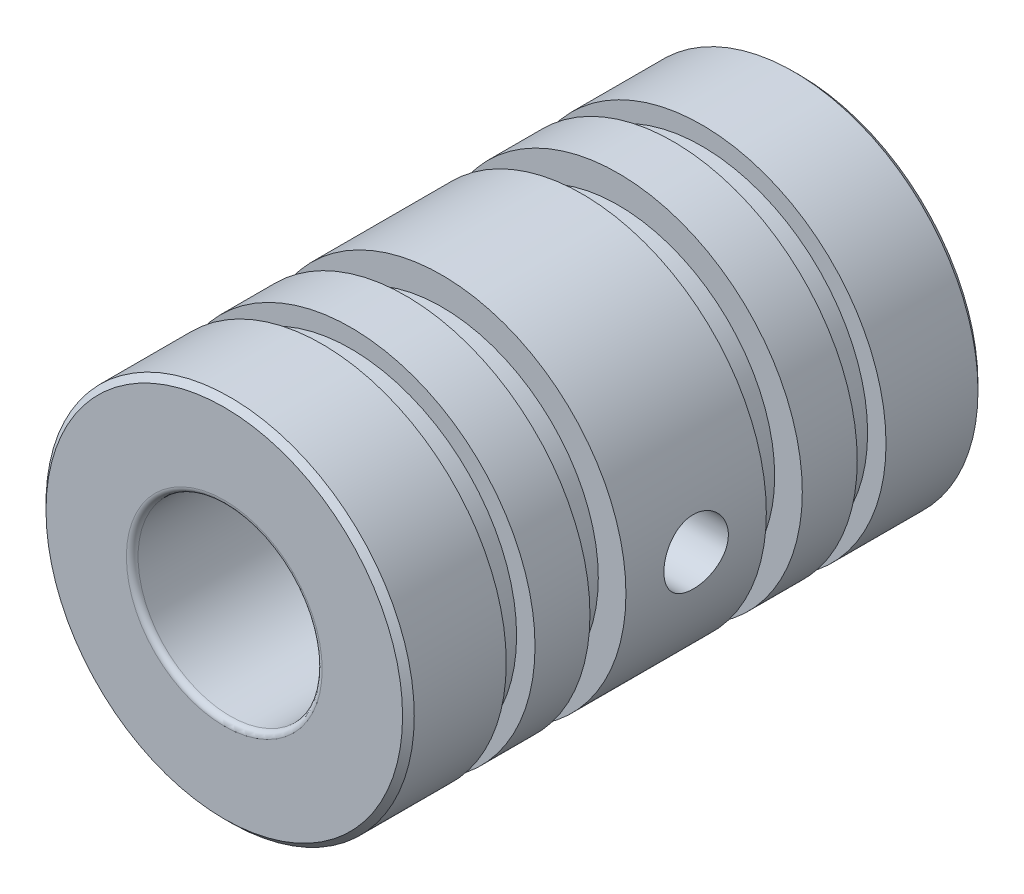
ISO-10303-21;
HEADER;
FILE_DESCRIPTION(('STEP AP214'),'2;1');
FILE_NAME('part.step','',(''),(''),'','','');
FILE_SCHEMA(('AUTOMOTIVE_DESIGN { 1 0 10303 214 1 1 1 1 }'));
ENDSEC;
DATA;
#1=APPLICATION_CONTEXT('core data for automotive mechanical design processes');
#2=APPLICATION_PROTOCOL_DEFINITION('international standard','automotive_design',2000,#1);
#3=PRODUCT_CONTEXT('',#1,'mechanical');
#4=PRODUCT('Part','Part','',(#3));
#5=PRODUCT_RELATED_PRODUCT_CATEGORY('part','',(#4));
#6=PRODUCT_DEFINITION_FORMATION('','',#4);
#7=PRODUCT_DEFINITION_CONTEXT('part definition',#1,'design');
#8=PRODUCT_DEFINITION('design','',#6,#7);
#9=PRODUCT_DEFINITION_SHAPE('','',#8);
#10=(LENGTH_UNIT() NAMED_UNIT(*) SI_UNIT(.MILLI.,.METRE.));
#11=(NAMED_UNIT(*) PLANE_ANGLE_UNIT() SI_UNIT($,.RADIAN.));
#12=(NAMED_UNIT(*) SI_UNIT($,.STERADIAN.) SOLID_ANGLE_UNIT());
#13=UNCERTAINTY_MEASURE_WITH_UNIT(LENGTH_MEASURE(1.E-05),#10,'distance_accuracy_value','');
#14=(GEOMETRIC_REPRESENTATION_CONTEXT(3) GLOBAL_UNCERTAINTY_ASSIGNED_CONTEXT((#13)) GLOBAL_UNIT_ASSIGNED_CONTEXT((#10,
#11,#12)) REPRESENTATION_CONTEXT('',''));
#15=CARTESIAN_POINT('',(0.,0.,0.));
#16=DIRECTION('',(0.,0.,1.));
#17=DIRECTION('',(1.,0.,0.));
#18=AXIS2_PLACEMENT_3D('',#15,#16,#17);
#19=CARTESIAN_POINT('',(0.,0.,12.5));
#20=DIRECTION('',(0.,0.,1.));
#21=DIRECTION('',(1.,0.,0.));
#22=AXIS2_PLACEMENT_3D('',#19,#20,#21);
#23=CYLINDRICAL_SURFACE('',#22,8.00000000000001);
#24=CARTESIAN_POINT('',(0.,0.,-3.05));
#25=DIRECTION('',(0.,0.,1.));
#26=DIRECTION('',(1.,0.,0.));
#27=AXIS2_PLACEMENT_3D('',#24,#25,#26);
#28=CIRCLE('',#27,8.00000000000002);
#29=CARTESIAN_POINT('',(8.00000000000002,0.,-3.05));
#30=VERTEX_POINT('',#29);
#31=EDGE_CURVE('E172',#30,#30,#28,.T.);
#32=ORIENTED_EDGE('',*,*,#31,.T.);
#33=EDGE_LOOP('',(#32));
#34=FACE_BOUND('',#33,.T.);
#35=CARTESIAN_POINT('',(8.00000000000001,0.,1.4));
#36=CARTESIAN_POINT('',(7.99999862840796,0.0780001751982829,1.39999692611606));
#37=CARTESIAN_POINT('',(7.99884740244653,0.156041460388733,1.39345937499059));
#38=CARTESIAN_POINT('',(7.99436582981277,0.309931215090021,1.36749507603401));
#39=CARTESIAN_POINT('',(7.99103354295156,0.385777669375428,1.34805685203911));
#40=CARTESIAN_POINT('',(7.98256322233297,0.533029372885323,1.29689940960397));
#41=CARTESIAN_POINT('',(7.97742672577383,0.604438342110771,1.26519064341269));
#42=CARTESIAN_POINT('',(7.96591125757,0.740914380295736,1.19042049275119));
#43=CARTESIAN_POINT('',(7.95953241187612,0.805982091136898,1.14736025894958));
#44=CARTESIAN_POINT('',(7.94616333498249,0.928619664519326,1.05062911217629));
#45=CARTESIAN_POINT('',(7.93916792163053,0.98611331984882,0.996862288286269));
#46=CARTESIAN_POINT('',(7.92539333056963,1.09131207719895,0.880450610451831));
#47=CARTESIAN_POINT('',(7.9186141672383,1.1390165295148,0.817805167703874));
#48=CARTESIAN_POINT('',(7.90598940099177,1.22359263935587,0.684885149818804));
#49=CARTESIAN_POINT('',(7.90015048940323,1.26038809619578,0.614561397517274));
#50=CARTESIAN_POINT('',(7.89013968959291,1.32161424136419,0.468611686073754));
#51=CARTESIAN_POINT('',(7.88596767685164,1.34604585332424,0.392986123480127));
#52=CARTESIAN_POINT('',(7.87981487136541,1.38160892847224,0.239390374846856));
#53=CARTESIAN_POINT('',(7.87781233032343,1.39287248959928,0.161451662324599));
#54=CARTESIAN_POINT('',(7.87615950549021,1.4021894800746,0.00476682590525788));
#55=CARTESIAN_POINT('',(7.87650903814844,1.40024394023127,-0.0739792345093653));
#56=CARTESIAN_POINT('',(7.87950103221331,1.38330536571091,-0.229095080346222));
#57=CARTESIAN_POINT('',(7.88211729196638,1.36846142113836,-0.305481725712561));
#58=CARTESIAN_POINT('',(7.88930688598159,1.32638169291944,-0.454663385873732));
#59=CARTESIAN_POINT('',(7.89388029360826,1.29914544473986,-0.527458265915615));
#60=CARTESIAN_POINT('',(7.90449682748978,1.23290516888148,-0.667832435606908));
#61=CARTESIAN_POINT('',(7.91054757059616,1.19383989394346,-0.735382223888715));
#62=CARTESIAN_POINT('',(7.92343182192954,1.10509390234727,-0.863024295264756));
#63=CARTESIAN_POINT('',(7.93026539961879,1.05541224334011,-0.923115915595786));
#64=CARTESIAN_POINT('',(7.94406011076402,0.946034723012704,-1.03499826759902));
#65=CARTESIAN_POINT('',(7.95102170984662,0.886211094489708,-1.08666411645392));
#66=CARTESIAN_POINT('',(7.96420180074155,0.758678144941895,-1.17924395538032));
#67=CARTESIAN_POINT('',(7.97042028681019,0.690968762974272,-1.22015786235052));
#68=CARTESIAN_POINT('',(7.98142370312537,0.549463949214037,-1.29008648652475));
#69=CARTESIAN_POINT('',(7.98620721208567,0.475662575179345,-1.31908941681279));
#70=CARTESIAN_POINT('',(7.99379047518486,0.324133596898233,-1.36425291754901));
#71=CARTESIAN_POINT('',(7.99659041251567,0.246406355934077,-1.38041467395514));
#72=CARTESIAN_POINT('',(7.99986621774949,0.0903076437528162,-1.39926601218044));
#73=CARTESIAN_POINT('',(8.00037163599559,0.0119574598226919,-1.40212690304103));
#74=CARTESIAN_POINT('',(7.99908265927999,-0.144102279722647,-1.39475309914216));
#75=CARTESIAN_POINT('',(7.99728836221911,-0.22181186246706,-1.38451896184911));
#76=CARTESIAN_POINT('',(7.99161989658909,-0.373849867024191,-1.35138808458838));
#77=CARTESIAN_POINT('',(7.9877597826616,-0.448197497529855,-1.32857688047147));
#78=CARTESIAN_POINT('',(7.9783907150381,-0.592013195796314,-1.27103111182445));
#79=CARTESIAN_POINT('',(7.9728816610333,-0.661480966386542,-1.236295821906));
#80=CARTESIAN_POINT('',(7.96075227223694,-0.794304113647957,-1.15550064953926));
#81=CARTESIAN_POINT('',(7.95412172074482,-0.857593993257696,-1.10933465730642));
#82=CARTESIAN_POINT('',(7.94051378582852,-0.975589608134913,-1.0071335998935));
#83=CARTESIAN_POINT('',(7.93353637448779,-1.03029465098563,-0.951097739424252));
#84=CARTESIAN_POINT('',(7.9199245979104,-1.13020891995216,-0.82997640395108));
#85=CARTESIAN_POINT('',(7.91329508970108,-1.17530193940062,-0.764794435124966));
#86=CARTESIAN_POINT('',(7.90122309566471,-1.2538984579292,-0.627680135437016));
#87=CARTESIAN_POINT('',(7.89578056952594,-1.28740235061652,-0.555748033938749));
#88=CARTESIAN_POINT('',(7.88673585998127,-1.34169922986162,-0.407488701764961));
#89=CARTESIAN_POINT('',(7.88312557061505,-1.36254828420235,-0.331182521898915));
#90=CARTESIAN_POINT('',(7.878134450485,-1.39111882773692,-0.17608213967264));
#91=CARTESIAN_POINT('',(7.87675340390794,-1.39884158769243,-0.0972881789078019));
#92=CARTESIAN_POINT('',(7.87638708241944,-1.40090212237177,0.0593893649039538));
#93=CARTESIAN_POINT('',(7.87736904279965,-1.39542294958482,0.137270523822818));
#94=CARTESIAN_POINT('',(7.8815459590275,-1.37163288257493,0.290984098702118));
#95=CARTESIAN_POINT('',(7.88474090550007,-1.35332204271184,0.366816523340362));
#96=CARTESIAN_POINT('',(7.89297082662609,-1.30446134075789,0.514198514154715));
#97=CARTESIAN_POINT('',(7.89800319385043,-1.27392881621193,0.585753983004286));
#98=CARTESIAN_POINT('',(7.90934317668918,-1.20151068594837,0.722756342236919));
#99=CARTESIAN_POINT('',(7.91565086607597,-1.15962442341396,0.788202878922046));
#100=CARTESIAN_POINT('',(7.92893382114377,-1.06504101398315,0.912051429794226));
#101=CARTESIAN_POINT('',(7.93591673369868,-1.01220974023825,0.970350206766199));
#102=CARTESIAN_POINT('',(7.94970383407226,-0.89751777269822,1.07731696014494));
#103=CARTESIAN_POINT('',(7.95650798037815,-0.83565500311526,1.12598271643599));
#104=CARTESIAN_POINT('',(7.96923191507495,-0.704088149914291,1.21264752531508));
#105=CARTESIAN_POINT('',(7.97514449399177,-0.63432738039585,1.25056159928381));
#106=CARTESIAN_POINT('',(7.98534894319634,-0.489349301034035,1.3140730206958));
#107=CARTESIAN_POINT('',(7.98964239150887,-0.41413738964011,1.33968236718766));
#108=CARTESIAN_POINT('',(7.99521152220682,-0.2822163760061,1.37243646451178));
#109=CARTESIAN_POINT('',(7.99699739577274,-0.226295502484522,1.38275581355877));
#110=CARTESIAN_POINT('',(7.99939212225499,-0.113590342513893,1.3965386315075));
#111=CARTESIAN_POINT('',(8.00000099890494,-0.0568060734981136,1.40000223865237));
#112=CARTESIAN_POINT('',(8.00000000000001,0.,1.4));
#113=B_SPLINE_CURVE_WITH_KNOTS('',3,(#35,#36,#37,#38,#39,#40,#41,#42,#43,#44,#45,#46,#47,#48,
#49,#50,#51,#52,#53,#54,#55,#56,#57,#58,#59,#60,#61,#62,#63,#64,#65,#66,#67,#68,#69,#70,#71,#72,
#73,#74,#75,#76,#77,#78,#79,#80,#81,#82,#83,#84,#85,#86,#87,#88,#89,#90,#91,#92,#93,#94,#95,#96,
#97,#98,#99,#100,#101,#102,#103,#104,#105,#106,#107,#108,#109,#110,#111,#112),.UNSPECIFIED.,.T.,
.F.,(4,2,2,2,2,2,2,2,2,2,2,2,2,2,2,2,2,2,2,2,2,2,2,2,2,2,2,2,2,2,2,2,2,2,2,2,2,2,4),(0.,
0.233792844733947,0.46779394587182,0.701596158243964,0.935374679803653,1.17135013119218,
1.40734123909815,1.64494390605394,1.8825288204635,2.1177093276277,2.35287148204762,
2.58535106672593,2.81783936676386,3.05155262682906,3.28528664075953,3.52222003892784,
3.75915526829015,3.99632440332745,4.23347163185304,4.46755589242396,4.70163018816148,
4.93413185201724,5.1666476623572,5.40140860563452,5.63618847401937,5.87366328975121,
6.11113003921753,6.34753685305678,6.58392077895654,6.81704600896559,7.05017025137284,
7.28296495175657,7.51577312225181,7.75162370751975,7.98752858598473,8.22524909733822,
8.46273732086145,8.63300772472175,8.80327469511674),.UNSPECIFIED.);
#114=CARTESIAN_POINT('',(8.00000000000001,0.,1.4));
#115=VERTEX_POINT('',#114);
#116=EDGE_CURVE('E93',#115,#115,#113,.T.);
#117=ORIENTED_EDGE('',*,*,#116,.T.);
#118=EDGE_LOOP('',(#117));
#119=FACE_BOUND('',#118,.T.);
#120=CARTESIAN_POINT('',(0.,0.,3.05));
#121=DIRECTION('',(0.,0.,1.));
#122=DIRECTION('',(1.,0.,0.));
#123=AXIS2_PLACEMENT_3D('',#120,#121,#122);
#124=CIRCLE('',#123,8.00000000000001);
#125=CARTESIAN_POINT('',(8.00000000000001,0.,3.05));
#126=VERTEX_POINT('',#125);
#127=EDGE_CURVE('E177',#126,#126,#124,.T.);
#128=ORIENTED_EDGE('',*,*,#127,.F.);
#129=EDGE_LOOP('',(#128));
#130=FACE_BOUND('',#129,.T.);
#131=ADVANCED_FACE('F41',(#34,#119,#130),#23,.T.);
#132=CARTESIAN_POINT('',(0.,0.,4.6125));
#133=DIRECTION('',(0.,0.,1.));
#134=DIRECTION('',(1.,0.,0.));
#135=AXIS2_PLACEMENT_3D('',#132,#133,#134);
#136=CIRCLE('',#135,8.00000000000001);
#137=CARTESIAN_POINT('',(8.00000000000001,0.,4.6125));
#138=VERTEX_POINT('',#137);
#139=EDGE_CURVE('E181',#138,#138,#136,.T.);
#140=ORIENTED_EDGE('',*,*,#139,.T.);
#141=EDGE_LOOP('',(#140));
#142=FACE_BOUND('',#141,.T.);
#143=CARTESIAN_POINT('',(0.,0.,7.00000000000001));
#144=DIRECTION('',(0.,0.,1.));
#145=DIRECTION('',(1.,0.,0.));
#146=AXIS2_PLACEMENT_3D('',#143,#144,#145);
#147=CIRCLE('',#146,8.00000000000001);
#148=CARTESIAN_POINT('',(8.00000000000001,0.,7.00000000000001));
#149=VERTEX_POINT('',#148);
#150=EDGE_CURVE('E217',#149,#149,#147,.T.);
#151=ORIENTED_EDGE('',*,*,#150,.F.);
#152=EDGE_LOOP('',(#151));
#153=FACE_BOUND('',#152,.T.);
#154=ADVANCED_FACE('F126',(#142,#153),#23,.T.);
#155=CARTESIAN_POINT('',(0.,0.,-4.6125));
#156=DIRECTION('',(0.,0.,1.));
#157=DIRECTION('',(1.,0.,0.));
#158=AXIS2_PLACEMENT_3D('',#155,#156,#157);
#159=CIRCLE('',#158,8.00000000000002);
#160=CARTESIAN_POINT('',(8.00000000000002,0.,-4.6125));
#161=VERTEX_POINT('',#160);
#162=EDGE_CURVE('E198',#161,#161,#159,.T.);
#163=ORIENTED_EDGE('',*,*,#162,.F.);
#164=EDGE_LOOP('',(#163));
#165=FACE_BOUND('',#164,.T.);
#166=CARTESIAN_POINT('',(0.,0.,-7.00000000000001));
#167=DIRECTION('',(0.,0.,1.));
#168=DIRECTION('',(1.,0.,0.));
#169=AXIS2_PLACEMENT_3D('',#166,#167,#168);
#170=CIRCLE('',#169,8.00000000000001);
#171=CARTESIAN_POINT('',(8.00000000000001,0.,-7.00000000000001));
#172=VERTEX_POINT('',#171);
#173=EDGE_CURVE('E214',#172,#172,#170,.T.);
#174=ORIENTED_EDGE('',*,*,#173,.T.);
#175=EDGE_LOOP('',(#174));
#176=FACE_BOUND('',#175,.T.);
#177=ADVANCED_FACE('F121',(#165,#176),#23,.T.);
#178=CARTESIAN_POINT('',(0.,0.,-12.5));
#179=DIRECTION('',(0.,0.,1.));
#180=DIRECTION('',(1.,0.,0.));
#181=AXIS2_PLACEMENT_3D('',#178,#179,#180);
#182=CYLINDRICAL_SURFACE('',#181,4.);
#183=CARTESIAN_POINT('',(0.,0.,-12.246));
#184=DIRECTION('',(0.,0.,-1.));
#185=DIRECTION('',(-1.,0.,0.));
#186=AXIS2_PLACEMENT_3D('',#183,#184,#185);
#187=CIRCLE('',#186,4.);
#188=CARTESIAN_POINT('',(-4.,0.,-12.246));
#189=VERTEX_POINT('',#188);
#190=EDGE_CURVE('E71',#189,#189,#187,.T.);
#191=ORIENTED_EDGE('',*,*,#190,.T.);
#192=EDGE_LOOP('',(#191));
#193=FACE_BOUND('',#192,.T.);
#194=CARTESIAN_POINT('',(0.,0.,12.246));
#195=DIRECTION('',(0.,0.,1.));
#196=DIRECTION('',(1.,0.,0.));
#197=AXIS2_PLACEMENT_3D('',#194,#195,#196);
#198=CIRCLE('',#197,4.);
#199=CARTESIAN_POINT('',(4.,0.,12.246));
#200=VERTEX_POINT('',#199);
#201=EDGE_CURVE('E75',#200,#200,#198,.T.);
#202=ORIENTED_EDGE('',*,*,#201,.T.);
#203=EDGE_LOOP('',(#202));
#204=FACE_BOUND('',#203,.T.);
#205=CARTESIAN_POINT('',(4.,0.,-1.4));
#206=CARTESIAN_POINT('',(4.00000082986481,-0.0761677462670815,-1.40000118265976));
#207=CARTESIAN_POINT('',(3.99780479114858,-0.152327048642296,-1.39376413143786));
#208=CARTESIAN_POINT('',(3.98926181700077,-0.302389343667563,-1.36906648273512));
#209=CARTESIAN_POINT('',(3.9829148630442,-0.376292326246413,-1.35060583070194));
#210=CARTESIAN_POINT('',(3.96675650768946,-0.519656942406437,-1.30218042459921));
#211=CARTESIAN_POINT('',(3.95695125145594,-0.589126197503234,-1.27223606809106));
#212=CARTESIAN_POINT('',(3.9348675989258,-0.722054658117936,-1.20178995549439));
#213=CARTESIAN_POINT('',(3.92258864059177,-0.785512492985255,-1.16128579955069));
#214=CARTESIAN_POINT('',(3.89632246944127,-0.907010356821302,-1.06926859373971));
#215=CARTESIAN_POINT('',(3.88229136710821,-0.964792785904163,-1.01742803271102));
#216=CARTESIAN_POINT('',(3.85433357977589,-1.07104474060504,-0.904905332421041));
#217=CARTESIAN_POINT('',(3.84040692188788,-1.11951192349204,-0.844220975725162));
#218=CARTESIAN_POINT('',(3.81374141685311,-1.20729182574434,-0.713338140176532));
#219=CARTESIAN_POINT('',(3.80105542448103,-1.24625853224648,-0.642895776616314));
#220=CARTESIAN_POINT('',(3.7789809773823,-1.31167972913805,-0.495942163883515));
#221=CARTESIAN_POINT('',(3.76959139787598,-1.33813848847447,-0.419432995729567));
#222=CARTESIAN_POINT('',(3.75563774541798,-1.37680655731033,-0.265462786927332));
#223=CARTESIAN_POINT('',(3.75090953094941,-1.3895022686182,-0.188139241145517));
#224=CARTESIAN_POINT('',(3.74633028750751,-1.40180479109549,-0.0323259524320673));
#225=CARTESIAN_POINT('',(3.74647756372738,-1.40141615061625,0.0461633757696369));
#226=CARTESIAN_POINT('',(3.75148970736213,-1.38793639960278,0.197819783553039));
#227=CARTESIAN_POINT('',(3.75611332175071,-1.37549486040994,0.271053992112326));
#228=CARTESIAN_POINT('',(3.76916001820362,-1.33932763324934,0.414320962516418));
#229=CARTESIAN_POINT('',(3.77758359931588,-1.31560046312242,0.484353302530355));
#230=CARTESIAN_POINT('',(3.79744244284543,-1.25713748436935,0.620644946711487));
#231=CARTESIAN_POINT('',(3.80892719702265,-1.22221866178551,0.686818220539376));
#232=CARTESIAN_POINT('',(3.83359525154267,-1.14249075401208,0.81256477959395));
#233=CARTESIAN_POINT('',(3.84677908105135,-1.09767858449078,0.872135997857578));
#234=CARTESIAN_POINT('',(3.87429296524979,-0.996373598074503,0.986617291347774));
#235=CARTESIAN_POINT('',(3.88864517297683,-0.939354431368266,1.04105729981949));
#236=CARTESIAN_POINT('',(3.91621496321696,-0.816822738902239,1.13973194875564));
#237=CARTESIAN_POINT('',(3.9294324133194,-0.751309224201322,1.18396539926824));
#238=CARTESIAN_POINT('',(3.95344925346483,-0.612573891647392,1.26140239650164));
#239=CARTESIAN_POINT('',(3.96421795197823,-0.539269521364162,1.29446822497806));
#240=CARTESIAN_POINT('',(3.98189952941453,-0.387670057189714,1.3476489227466));
#241=CARTESIAN_POINT('',(3.98881389118768,-0.309376895534761,1.36776877310864));
#242=CARTESIAN_POINT('',(3.99775624065143,-0.153992817472567,1.39362632536871));
#243=CARTESIAN_POINT('',(3.99999955666171,-0.0770197194508017,1.39999832260757));
#244=CARTESIAN_POINT('',(4.00000044278596,0.0769185945753714,1.40000167573684));
#245=CARTESIAN_POINT('',(3.99775885923408,0.153883809326499,1.3936354354281));
#246=CARTESIAN_POINT('',(3.98918412928159,0.303004917885428,1.36883786003854));
#247=CARTESIAN_POINT('',(3.98298652329724,0.375235810959552,1.35080594490657));
#248=CARTESIAN_POINT('',(3.96725836043701,0.515610017670745,1.30369847403978));
#249=CARTESIAN_POINT('',(3.95772737231119,0.583752801079462,1.2746214893283));
#250=CARTESIAN_POINT('',(3.93596170115072,0.716122717842398,1.20536396454741));
#251=CARTESIAN_POINT('',(3.92365949372611,0.780189296509797,1.16489840611859));
#252=CARTESIAN_POINT('',(3.89773406986807,0.900823115033457,1.07434192817074));
#253=CARTESIAN_POINT('',(3.88411041556164,0.957387854290392,1.02424781271043));
#254=CARTESIAN_POINT('',(3.85620335889683,1.06438126152157,0.912879919354375));
#255=CARTESIAN_POINT('',(3.84192126232498,1.11435780464716,0.85117035680927));
#256=CARTESIAN_POINT('',(3.81499671476278,1.20331497050291,0.719941640240066));
#257=CARTESIAN_POINT('',(3.80235432130955,1.24229520742934,0.650422212327651));
#258=CARTESIAN_POINT('',(3.78024221979789,1.30804392591699,0.505333083917003));
#259=CARTESIAN_POINT('',(3.77077257631505,1.3348121589289,0.42976326031266));
#260=CARTESIAN_POINT('',(3.756270168259,1.3751006647498,0.274773818445463));
#261=CARTESIAN_POINT('',(3.75123512721405,1.38862773521356,0.195356197538719));
#262=CARTESIAN_POINT('',(3.74644824414629,1.40148775718282,0.0397518713831283));
#263=CARTESIAN_POINT('',(3.74641418720457,1.40157892312296,-0.0363641186741486));
#264=CARTESIAN_POINT('',(3.75092530733651,1.38946040009142,-0.18746504926304));
#265=CARTESIAN_POINT('',(3.75547015540141,1.37725159491141,-0.26245007066541));
#266=CARTESIAN_POINT('',(3.76840677603561,1.34143861255391,-0.407420383497136));
#267=CARTESIAN_POINT('',(3.77670717816819,1.31810442288836,-0.477481186672188));
#268=CARTESIAN_POINT('',(3.79617795864866,1.26092847831457,-0.612743237922765));
#269=CARTESIAN_POINT('',(3.80734901226808,1.22708425070908,-0.677943337939287));
#270=CARTESIAN_POINT('',(3.83195950276457,1.14798808279442,-0.804973830156919));
#271=CARTESIAN_POINT('',(3.84548113997338,1.10227296289482,-0.866499760080587));
#272=CARTESIAN_POINT('',(3.87295024586658,1.00148960453626,-0.981251051473409));
#273=CARTESIAN_POINT('',(3.88689783972523,0.946418594576191,-1.03447394434081));
#274=CARTESIAN_POINT('',(3.91439467810872,0.825541266014723,-1.13351351268562));
#275=CARTESIAN_POINT('',(3.92789838227884,0.759365591451294,-1.17889378020378));
#276=CARTESIAN_POINT('',(3.95231210468628,0.619867051633332,-1.25784939811183));
#277=CARTESIAN_POINT('',(3.96322246637471,0.54654513461198,-1.29142631196949));
#278=CARTESIAN_POINT('',(3.98110512406599,0.395611935090641,-1.34530288761647));
#279=CARTESIAN_POINT('',(3.98811886032264,0.318055818501268,-1.36574264342804));
#280=CARTESIAN_POINT('',(3.99756505486416,0.160329396642134,-1.39308819400206));
#281=CARTESIAN_POINT('',(3.99999912663844,0.0801600221960442,-1.39999875535201));
#282=CARTESIAN_POINT('',(4.,0.,-1.4));
#283=B_SPLINE_CURVE_WITH_KNOTS('',3,(#205,#206,#207,#208,#209,#210,#211,#212,#213,#214,#215,
#216,#217,#218,#219,#220,#221,#222,#223,#224,#225,#226,#227,#228,#229,#230,#231,#232,#233,#234,
#235,#236,#237,#238,#239,#240,#241,#242,#243,#244,#245,#246,#247,#248,#249,#250,#251,#252,#253,
#254,#255,#256,#257,#258,#259,#260,#261,#262,#263,#264,#265,#266,#267,#268,#269,#270,#271,#272,
#273,#274,#275,#276,#277,#278,#279,#280,#281,#282),.UNSPECIFIED.,.T.,.F.,(4,2,2,2,2,2,2,2,2,2,2,
2,2,2,2,2,2,2,2,2,2,2,2,2,2,2,2,2,2,2,2,2,2,2,2,2,2,2,4),(0.,0.228207977612567,
0.456416973694618,0.684222484352804,0.912079812048508,1.14768516041179,1.38334968485675,
1.62662153792174,1.86981030255115,2.10409213566523,2.33829252912541,2.56053520214027,
2.78280707068728,3.00891695199439,3.23509742469696,3.47438312550875,3.71369670983951,
3.95586205695962,4.19793417319747,4.4285750217208,4.65917235069278,4.88226454841274,
5.10538561894157,5.33468151083444,5.5640536431922,5.80497030253308,6.04589541334731,
6.28682542745982,6.52763168964841,6.75484326316778,6.98203851198392,7.20398099743384,
7.42597573891607,7.65845228355459,7.89099781533054,8.13391912161406,8.376808238498,
8.617062229206,8.85723155870924),.UNSPECIFIED.);
#284=CARTESIAN_POINT('',(4.,0.,-1.4));
#285=VERTEX_POINT('',#284);
#286=EDGE_CURVE('E84',#285,#285,#283,.T.);
#287=ORIENTED_EDGE('',*,*,#286,.F.);
#288=EDGE_LOOP('',(#287));
#289=FACE_BOUND('',#288,.T.);
#290=ADVANCED_FACE('F96',(#193,#204,#289),#182,.F.);
#291=CARTESIAN_POINT('',(0.,0.,12.5));
#292=DIRECTION('',(0.,0.,1.));
#293=DIRECTION('',(1.,0.,0.));
#294=AXIS2_PLACEMENT_3D('',#291,#292,#293);
#295=PLANE('',#294);
#296=CARTESIAN_POINT('',(0.,0.,12.5));
#297=DIRECTION('',(0.,0.,1.));
#298=DIRECTION('',(1.,0.,0.));
#299=AXIS2_PLACEMENT_3D('',#296,#297,#298);
#300=CIRCLE('',#299,7.74600000000001);
#301=CARTESIAN_POINT('',(7.74600000000001,0.,12.5));
#302=VERTEX_POINT('',#301);
#303=EDGE_CURVE('E49',#302,#302,#300,.T.);
#304=ORIENTED_EDGE('',*,*,#303,.T.);
#305=EDGE_LOOP('',(#304));
#306=FACE_BOUND('',#305,.T.);
#307=CARTESIAN_POINT('',(0.,0.,12.5));
#308=DIRECTION('',(0.,0.,1.));
#309=DIRECTION('',(1.,0.,0.));
#310=AXIS2_PLACEMENT_3D('',#307,#308,#309);
#311=CIRCLE('',#310,4.254);
#312=CARTESIAN_POINT('',(4.254,0.,12.5));
#313=VERTEX_POINT('',#312);
#314=EDGE_CURVE('E67',#313,#313,#311,.F.);
#315=ORIENTED_EDGE('',*,*,#314,.T.);
#316=EDGE_LOOP('',(#315));
#317=FACE_BOUND('',#316,.T.);
#318=ADVANCED_FACE('F145',(#306,#317),#295,.T.);
#319=CARTESIAN_POINT('',(0.,0.,12.5));
#320=DIRECTION('',(0.,0.,1.));
#321=DIRECTION('',(1.,0.,0.));
#322=AXIS2_PLACEMENT_3D('',#319,#320,#321);
#323=CYLINDRICAL_SURFACE('',#322,8.);
#324=CARTESIAN_POINT('',(0.,0.,12.246));
#325=DIRECTION('',(0.,0.,1.));
#326=DIRECTION('',(1.,0.,0.));
#327=AXIS2_PLACEMENT_3D('',#324,#325,#326);
#328=CIRCLE('',#327,8.);
#329=CARTESIAN_POINT('',(8.,0.,12.246));
#330=VERTEX_POINT('',#329);
#331=EDGE_CURVE('E10',#330,#330,#328,.F.);
#332=ORIENTED_EDGE('',*,*,#331,.T.);
#333=EDGE_LOOP('',(#332));
#334=FACE_BOUND('',#333,.T.);
#335=CARTESIAN_POINT('',(0.,0.,8.25000000000001));
#336=DIRECTION('',(0.,0.,1.));
#337=DIRECTION('',(1.,0.,0.));
#338=AXIS2_PLACEMENT_3D('',#335,#336,#337);
#339=CIRCLE('',#338,8.);
#340=CARTESIAN_POINT('',(8.,0.,8.25000000000001));
#341=VERTEX_POINT('',#340);
#342=EDGE_CURVE('E83',#341,#341,#339,.T.);
#343=ORIENTED_EDGE('',*,*,#342,.T.);
#344=EDGE_LOOP('',(#343));
#345=FACE_BOUND('',#344,.T.);
#346=ADVANCED_FACE('F141',(#334,#345),#323,.T.);
#347=CARTESIAN_POINT('',(0.,8.,8.25000000000001));
#348=DIRECTION('',(0.,0.,-1.));
#349=DIRECTION('',(-1.,0.,0.));
#350=AXIS2_PLACEMENT_3D('',#347,#348,#349);
#351=PLANE('',#350);
#352=CARTESIAN_POINT('',(0.,0.,8.25000000000001));
#353=DIRECTION('',(0.,0.,1.));
#354=DIRECTION('',(1.,0.,0.));
#355=AXIS2_PLACEMENT_3D('',#352,#353,#354);
#356=CIRCLE('',#355,7.2);
#357=CARTESIAN_POINT('',(7.2,0.,8.25000000000001));
#358=VERTEX_POINT('',#357);
#359=EDGE_CURVE('E232',#358,#358,#356,.T.);
#360=ORIENTED_EDGE('',*,*,#359,.T.);
#361=EDGE_LOOP('',(#360));
#362=FACE_BOUND('',#361,.T.);
#363=ORIENTED_EDGE('',*,*,#342,.F.);
#364=EDGE_LOOP('',(#363));
#365=FACE_BOUND('',#364,.T.);
#366=ADVANCED_FACE('F137',(#362,#365),#351,.T.);
#367=CARTESIAN_POINT('',(0.,0.,12.5));
#368=DIRECTION('',(0.,0.,1.));
#369=DIRECTION('',(1.,0.,0.));
#370=AXIS2_PLACEMENT_3D('',#367,#368,#369);
#371=CYLINDRICAL_SURFACE('',#370,7.2);
#372=CARTESIAN_POINT('',(0.,0.,7.00000000000001));
#373=DIRECTION('',(0.,0.,1.));
#374=DIRECTION('',(1.,0.,0.));
#375=AXIS2_PLACEMENT_3D('',#372,#373,#374);
#376=CIRCLE('',#375,7.2);
#377=CARTESIAN_POINT('',(7.2,0.,7.00000000000001));
#378=VERTEX_POINT('',#377);
#379=EDGE_CURVE('E224',#378,#378,#376,.T.);
#380=ORIENTED_EDGE('',*,*,#379,.T.);
#381=EDGE_LOOP('',(#380));
#382=FACE_BOUND('',#381,.T.);
#383=ORIENTED_EDGE('',*,*,#359,.F.);
#384=EDGE_LOOP('',(#383));
#385=FACE_BOUND('',#384,.T.);
#386=ADVANCED_FACE('F133',(#382,#385),#371,.T.);
#387=CARTESIAN_POINT('',(0.,7.2,7.00000000000001));
#388=DIRECTION('',(0.,0.,1.));
#389=DIRECTION('',(1.,0.,0.));
#390=AXIS2_PLACEMENT_3D('',#387,#388,#389);
#391=PLANE('',#390);
#392=ORIENTED_EDGE('',*,*,#150,.T.);
#393=EDGE_LOOP('',(#392));
#394=FACE_BOUND('',#393,.T.);
#395=ORIENTED_EDGE('',*,*,#379,.F.);
#396=EDGE_LOOP('',(#395));
#397=FACE_BOUND('',#396,.T.);
#398=ADVANCED_FACE('F130',(#394,#397),#391,.T.);
#399=CARTESIAN_POINT('',(0.,7.2,-7.00000000000001));
#400=DIRECTION('',(0.,0.,-1.));
#401=DIRECTION('',(-1.,0.,0.));
#402=AXIS2_PLACEMENT_3D('',#399,#400,#401);
#403=PLANE('',#402);
#404=CARTESIAN_POINT('',(0.,0.,-7.00000000000001));
#405=DIRECTION('',(0.,0.,1.));
#406=DIRECTION('',(1.,0.,0.));
#407=AXIS2_PLACEMENT_3D('',#404,#405,#406);
#408=CIRCLE('',#407,7.2);
#409=CARTESIAN_POINT('',(7.2,0.,-7.00000000000001));
#410=VERTEX_POINT('',#409);
#411=EDGE_CURVE('E218',#410,#410,#408,.T.);
#412=ORIENTED_EDGE('',*,*,#411,.T.);
#413=EDGE_LOOP('',(#412));
#414=FACE_BOUND('',#413,.T.);
#415=ORIENTED_EDGE('',*,*,#173,.F.);
#416=EDGE_LOOP('',(#415));
#417=FACE_BOUND('',#416,.T.);
#418=ADVANCED_FACE('F128',(#414,#417),#403,.T.);
#419=CARTESIAN_POINT('',(0.,0.,12.5));
#420=DIRECTION('',(0.,0.,1.));
#421=DIRECTION('',(1.,0.,0.));
#422=AXIS2_PLACEMENT_3D('',#419,#420,#421);
#423=CYLINDRICAL_SURFACE('',#422,7.2);
#424=CARTESIAN_POINT('',(0.,0.,-8.25000000000001));
#425=DIRECTION('',(0.,0.,1.));
#426=DIRECTION('',(1.,0.,0.));
#427=AXIS2_PLACEMENT_3D('',#424,#425,#426);
#428=CIRCLE('',#427,7.2);
#429=CARTESIAN_POINT('',(7.2,0.,-8.25000000000001));
#430=VERTEX_POINT('',#429);
#431=EDGE_CURVE('E227',#430,#430,#428,.T.);
#432=ORIENTED_EDGE('',*,*,#431,.T.);
#433=EDGE_LOOP('',(#432));
#434=FACE_BOUND('',#433,.T.);
#435=ORIENTED_EDGE('',*,*,#411,.F.);
#436=EDGE_LOOP('',(#435));
#437=FACE_BOUND('',#436,.T.);
#438=ADVANCED_FACE('F276',(#434,#437),#423,.T.);
#439=CARTESIAN_POINT('',(0.,8.,-8.25000000000001));
#440=DIRECTION('',(0.,0.,1.));
#441=DIRECTION('',(1.,0.,0.));
#442=AXIS2_PLACEMENT_3D('',#439,#440,#441);
#443=PLANE('',#442);
#444=CARTESIAN_POINT('',(0.,0.,-8.25000000000001));
#445=DIRECTION('',(0.,0.,1.));
#446=DIRECTION('',(1.,0.,0.));
#447=AXIS2_PLACEMENT_3D('',#444,#445,#446);
#448=CIRCLE('',#447,8.);
#449=CARTESIAN_POINT('',(8.,0.,-8.25000000000001));
#450=VERTEX_POINT('',#449);
#451=EDGE_CURVE('E118',#450,#450,#448,.T.);
#452=ORIENTED_EDGE('',*,*,#451,.T.);
#453=EDGE_LOOP('',(#452));
#454=FACE_BOUND('',#453,.T.);
#455=ORIENTED_EDGE('',*,*,#431,.F.);
#456=EDGE_LOOP('',(#455));
#457=FACE_BOUND('',#456,.T.);
#458=ADVANCED_FACE('F264',(#454,#457),#443,.T.);
#459=CARTESIAN_POINT('',(0.,0.,12.5));
#460=DIRECTION('',(0.,0.,1.));
#461=DIRECTION('',(1.,0.,0.));
#462=AXIS2_PLACEMENT_3D('',#459,#460,#461);
#463=CYLINDRICAL_SURFACE('',#462,8.);
#464=CARTESIAN_POINT('',(0.,0.,-12.246));
#465=DIRECTION('',(0.,0.,-1.));
#466=DIRECTION('',(-1.,0.,0.));
#467=AXIS2_PLACEMENT_3D('',#464,#465,#466);
#468=CIRCLE('',#467,8.);
#469=CARTESIAN_POINT('',(-8.,0.,-12.246));
#470=VERTEX_POINT('',#469);
#471=EDGE_CURVE('E61',#470,#470,#468,.F.);
#472=ORIENTED_EDGE('',*,*,#471,.T.);
#473=EDGE_LOOP('',(#472));
#474=FACE_BOUND('',#473,.T.);
#475=ORIENTED_EDGE('',*,*,#451,.F.);
#476=EDGE_LOOP('',(#475));
#477=FACE_BOUND('',#476,.T.);
#478=ADVANCED_FACE('F267',(#474,#477),#463,.T.);
#479=CARTESIAN_POINT('',(0.,0.,-12.5));
#480=DIRECTION('',(0.,0.,-1.));
#481=DIRECTION('',(-1.,0.,0.));
#482=AXIS2_PLACEMENT_3D('',#479,#480,#481);
#483=PLANE('',#482);
#484=CARTESIAN_POINT('',(0.,0.,-12.5));
#485=DIRECTION('',(0.,0.,-1.));
#486=DIRECTION('',(-1.,0.,0.));
#487=AXIS2_PLACEMENT_3D('',#484,#485,#486);
#488=CIRCLE('',#487,7.74600000000001);
#489=CARTESIAN_POINT('',(-7.74600000000001,0.,-12.5));
#490=VERTEX_POINT('',#489);
#491=EDGE_CURVE('E55',#490,#490,#488,.T.);
#492=ORIENTED_EDGE('',*,*,#491,.T.);
#493=EDGE_LOOP('',(#492));
#494=FACE_BOUND('',#493,.T.);
#495=CARTESIAN_POINT('',(0.,0.,-12.5));
#496=DIRECTION('',(0.,0.,-1.));
#497=DIRECTION('',(-1.,0.,0.));
#498=AXIS2_PLACEMENT_3D('',#495,#496,#497);
#499=CIRCLE('',#498,4.254);
#500=CARTESIAN_POINT('',(-4.254,0.,-12.5));
#501=VERTEX_POINT('',#500);
#502=EDGE_CURVE('E79',#501,#501,#499,.F.);
#503=ORIENTED_EDGE('',*,*,#502,.T.);
#504=EDGE_LOOP('',(#503));
#505=FACE_BOUND('',#504,.T.);
#506=ADVANCED_FACE('F104',(#494,#505),#483,.T.);
#507=CARTESIAN_POINT('',(8.00000000000001,0.,0.));
#508=DIRECTION('',(-1.,0.,0.));
#509=DIRECTION('',(0.,0.,1.));
#510=AXIS2_PLACEMENT_3D('',#507,#508,#509);
#511=CYLINDRICAL_SURFACE('',#510,1.4);
#512=ORIENTED_EDGE('',*,*,#116,.F.);
#513=EDGE_LOOP('',(#512));
#514=FACE_BOUND('',#513,.T.);
#515=ORIENTED_EDGE('',*,*,#286,.T.);
#516=EDGE_LOOP('',(#515));
#517=FACE_BOUND('',#516,.T.);
#518=ADVANCED_FACE('F99',(#514,#517),#511,.F.);
#519=CARTESIAN_POINT('',(0.,0.,-12.246));
#520=DIRECTION('',(0.,0.,-1.));
#521=DIRECTION('',(-1.,0.,0.));
#522=AXIS2_PLACEMENT_3D('',#519,#520,#521);
#523=TOROIDAL_SURFACE('',#522,4.254,0.254);
#524=ORIENTED_EDGE('',*,*,#190,.F.);
#525=EDGE_LOOP('',(#524));
#526=FACE_BOUND('',#525,.T.);
#527=ORIENTED_EDGE('',*,*,#502,.F.);
#528=EDGE_LOOP('',(#527));
#529=FACE_BOUND('',#528,.T.);
#530=ADVANCED_FACE('F103',(#526,#529),#523,.T.);
#531=CARTESIAN_POINT('',(0.,0.,12.246));
#532=DIRECTION('',(0.,0.,1.));
#533=DIRECTION('',(1.,0.,0.));
#534=AXIS2_PLACEMENT_3D('',#531,#532,#533);
#535=TOROIDAL_SURFACE('',#534,4.254,0.254);
#536=ORIENTED_EDGE('',*,*,#314,.F.);
#537=EDGE_LOOP('',(#536));
#538=FACE_BOUND('',#537,.T.);
#539=ORIENTED_EDGE('',*,*,#201,.F.);
#540=EDGE_LOOP('',(#539));
#541=FACE_BOUND('',#540,.T.);
#542=ADVANCED_FACE('F150',(#538,#541),#535,.T.);
#543=CARTESIAN_POINT('',(0.,0.,-12.246));
#544=DIRECTION('',(0.,0.,1.));
#545=DIRECTION('',(1.,0.,0.));
#546=AXIS2_PLACEMENT_3D('',#543,#544,#545);
#547=CONICAL_SURFACE('',#546,8.,0.785398163397455);
#548=ORIENTED_EDGE('',*,*,#491,.F.);
#549=EDGE_LOOP('',(#548));
#550=FACE_BOUND('',#549,.T.);
#551=ORIENTED_EDGE('',*,*,#471,.F.);
#552=EDGE_LOOP('',(#551));
#553=FACE_BOUND('',#552,.T.);
#554=ADVANCED_FACE('F153',(#550,#553),#547,.T.);
#555=CARTESIAN_POINT('',(0.,0.,12.5));
#556=DIRECTION('',(0.,0.,-1.));
#557=DIRECTION('',(-1.,0.,0.));
#558=AXIS2_PLACEMENT_3D('',#555,#556,#557);
#559=CONICAL_SURFACE('',#558,7.74600000000001,0.785398163397438);
#560=ORIENTED_EDGE('',*,*,#331,.F.);
#561=EDGE_LOOP('',(#560));
#562=FACE_BOUND('',#561,.T.);
#563=ORIENTED_EDGE('',*,*,#303,.F.);
#564=EDGE_LOOP('',(#563));
#565=FACE_BOUND('',#564,.T.);
#566=ADVANCED_FACE('F43',(#562,#565),#559,.T.);
#567=CARTESIAN_POINT('',(0.,8.00000000000001,4.6125));
#568=DIRECTION('',(0.,0.,1.));
#569=DIRECTION('',(1.,0.,0.));
#570=AXIS2_PLACEMENT_3D('',#567,#568,#569);
#571=PLANE('',#570);
#572=ORIENTED_EDGE('',*,*,#139,.F.);
#573=EDGE_LOOP('',(#572));
#574=FACE_BOUND('',#573,.T.);
#575=CARTESIAN_POINT('',(0.,0.,4.6125));
#576=DIRECTION('',(0.,0.,1.));
#577=DIRECTION('',(1.,0.,0.));
#578=AXIS2_PLACEMENT_3D('',#575,#576,#577);
#579=CIRCLE('',#578,6.80000000000002);
#580=CARTESIAN_POINT('',(6.80000000000002,0.,4.6125));
#581=VERTEX_POINT('',#580);
#582=EDGE_CURVE('E94',#581,#581,#579,.T.);
#583=ORIENTED_EDGE('',*,*,#582,.T.);
#584=EDGE_LOOP('',(#583));
#585=FACE_BOUND('',#584,.T.);
#586=ADVANCED_FACE('F106',(#574,#585),#571,.F.);
#587=CARTESIAN_POINT('',(0.,0.,12.5));
#588=DIRECTION('',(0.,0.,1.));
#589=DIRECTION('',(1.,0.,0.));
#590=AXIS2_PLACEMENT_3D('',#587,#588,#589);
#591=CYLINDRICAL_SURFACE('',#590,6.80000000000002);
#592=ORIENTED_EDGE('',*,*,#582,.F.);
#593=EDGE_LOOP('',(#592));
#594=FACE_BOUND('',#593,.T.);
#595=CARTESIAN_POINT('',(0.,0.,3.05));
#596=DIRECTION('',(0.,0.,1.));
#597=DIRECTION('',(1.,0.,0.));
#598=AXIS2_PLACEMENT_3D('',#595,#596,#597);
#599=CIRCLE('',#598,6.80000000000002);
#600=CARTESIAN_POINT('',(6.80000000000002,0.,3.05));
#601=VERTEX_POINT('',#600);
#602=EDGE_CURVE('E180',#601,#601,#599,.T.);
#603=ORIENTED_EDGE('',*,*,#602,.T.);
#604=EDGE_LOOP('',(#603));
#605=FACE_BOUND('',#604,.T.);
#606=ADVANCED_FACE('F398',(#594,#605),#591,.T.);
#607=CARTESIAN_POINT('',(0.,8.00000000000001,3.05));
#608=DIRECTION('',(0.,0.,-1.));
#609=DIRECTION('',(-1.,0.,0.));
#610=AXIS2_PLACEMENT_3D('',#607,#608,#609);
#611=PLANE('',#610);
#612=ORIENTED_EDGE('',*,*,#602,.F.);
#613=EDGE_LOOP('',(#612));
#614=FACE_BOUND('',#613,.T.);
#615=ORIENTED_EDGE('',*,*,#127,.T.);
#616=EDGE_LOOP('',(#615));
#617=FACE_BOUND('',#616,.T.);
#618=ADVANCED_FACE('F404',(#614,#617),#611,.F.);
#619=CARTESIAN_POINT('',(0.,8.00000000000002,-3.05));
#620=DIRECTION('',(0.,0.,1.));
#621=DIRECTION('',(1.,0.,0.));
#622=AXIS2_PLACEMENT_3D('',#619,#620,#621);
#623=PLANE('',#622);
#624=ORIENTED_EDGE('',*,*,#31,.F.);
#625=EDGE_LOOP('',(#624));
#626=FACE_BOUND('',#625,.T.);
#627=CARTESIAN_POINT('',(0.,0.,-3.05));
#628=DIRECTION('',(0.,0.,1.));
#629=DIRECTION('',(1.,0.,0.));
#630=AXIS2_PLACEMENT_3D('',#627,#628,#629);
#631=CIRCLE('',#630,6.80000000000002);
#632=CARTESIAN_POINT('',(6.80000000000002,0.,-3.05));
#633=VERTEX_POINT('',#632);
#634=EDGE_CURVE('E188',#633,#633,#631,.T.);
#635=ORIENTED_EDGE('',*,*,#634,.T.);
#636=EDGE_LOOP('',(#635));
#637=FACE_BOUND('',#636,.T.);
#638=ADVANCED_FACE('F411',(#626,#637),#623,.F.);
#639=CARTESIAN_POINT('',(0.,0.,12.5));
#640=DIRECTION('',(0.,0.,1.));
#641=DIRECTION('',(1.,0.,0.));
#642=AXIS2_PLACEMENT_3D('',#639,#640,#641);
#643=CYLINDRICAL_SURFACE('',#642,6.80000000000002);
#644=ORIENTED_EDGE('',*,*,#634,.F.);
#645=EDGE_LOOP('',(#644));
#646=FACE_BOUND('',#645,.T.);
#647=CARTESIAN_POINT('',(0.,0.,-4.6125));
#648=DIRECTION('',(0.,0.,1.));
#649=DIRECTION('',(1.,0.,0.));
#650=AXIS2_PLACEMENT_3D('',#647,#648,#649);
#651=CIRCLE('',#650,6.80000000000002);
#652=CARTESIAN_POINT('',(6.80000000000002,0.,-4.6125));
#653=VERTEX_POINT('',#652);
#654=EDGE_CURVE('E194',#653,#653,#651,.T.);
#655=ORIENTED_EDGE('',*,*,#654,.T.);
#656=EDGE_LOOP('',(#655));
#657=FACE_BOUND('',#656,.T.);
#658=ADVANCED_FACE('F419',(#646,#657),#643,.T.);
#659=CARTESIAN_POINT('',(0.,8.00000000000002,-4.6125));
#660=DIRECTION('',(0.,0.,-1.));
#661=DIRECTION('',(-1.,0.,0.));
#662=AXIS2_PLACEMENT_3D('',#659,#660,#661);
#663=PLANE('',#662);
#664=ORIENTED_EDGE('',*,*,#654,.F.);
#665=EDGE_LOOP('',(#664));
#666=FACE_BOUND('',#665,.T.);
#667=ORIENTED_EDGE('',*,*,#162,.T.);
#668=EDGE_LOOP('',(#667));
#669=FACE_BOUND('',#668,.T.);
#670=ADVANCED_FACE('F210',(#666,#669),#663,.F.);
#671=CLOSED_SHELL('',(#131,#154,#177,#290,#318,#346,#366,#386,#398,#418,#438,#458,#478,#506,
#518,#530,#542,#554,#566,#586,#606,#618,#638,#658,#670));
#672=MANIFOLD_SOLID_BREP('B2',#671);
#673=ADVANCED_BREP_SHAPE_REPRESENTATION('',(#18,#672),#14);
#674=SHAPE_DEFINITION_REPRESENTATION(#9,#673);
ENDSEC;
END-ISO-10303-21;
